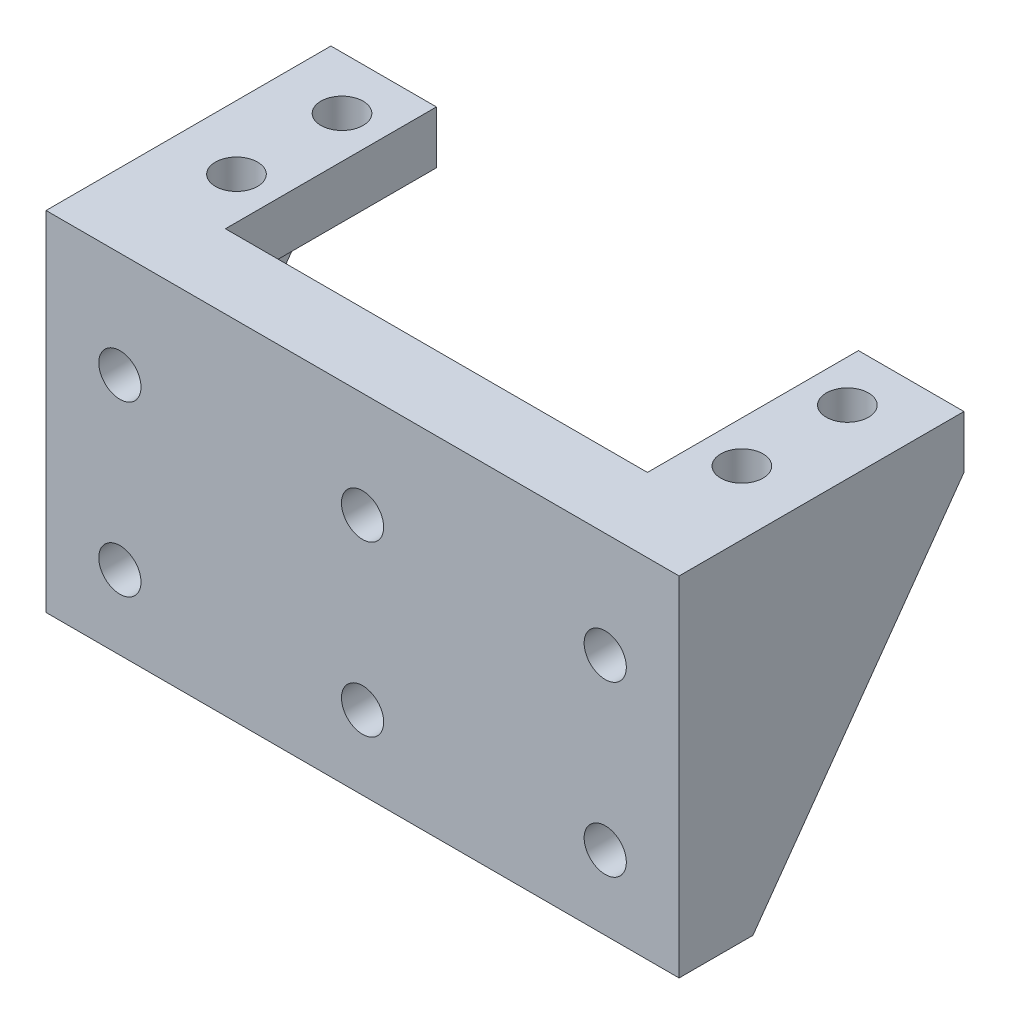
ISO-10303-21;
HEADER;
FILE_DESCRIPTION(('STEP AP214'),'2;1');
FILE_NAME('part.step','',(''),(''),'','','');
FILE_SCHEMA(('AUTOMOTIVE_DESIGN { 1 0 10303 214 1 1 1 1 }'));
ENDSEC;
DATA;
#1=APPLICATION_CONTEXT('core data for automotive mechanical design processes');
#2=APPLICATION_PROTOCOL_DEFINITION('international standard','automotive_design',2000,#1);
#3=PRODUCT_CONTEXT('',#1,'mechanical');
#4=PRODUCT('Part','Part','',(#3));
#5=PRODUCT_RELATED_PRODUCT_CATEGORY('part','',(#4));
#6=PRODUCT_DEFINITION_FORMATION('','',#4);
#7=PRODUCT_DEFINITION_CONTEXT('part definition',#1,'design');
#8=PRODUCT_DEFINITION('design','',#6,#7);
#9=PRODUCT_DEFINITION_SHAPE('','',#8);
#10=(LENGTH_UNIT() NAMED_UNIT(*) SI_UNIT(.MILLI.,.METRE.));
#11=(NAMED_UNIT(*) PLANE_ANGLE_UNIT() SI_UNIT($,.RADIAN.));
#12=(NAMED_UNIT(*) SI_UNIT($,.STERADIAN.) SOLID_ANGLE_UNIT());
#13=UNCERTAINTY_MEASURE_WITH_UNIT(LENGTH_MEASURE(1.E-05),#10,'distance_accuracy_value','');
#14=(GEOMETRIC_REPRESENTATION_CONTEXT(3) GLOBAL_UNCERTAINTY_ASSIGNED_CONTEXT((#13)) GLOBAL_UNIT_ASSIGNED_CONTEXT((#10,
#11,#12)) REPRESENTATION_CONTEXT('',''));
#15=CARTESIAN_POINT('',(0.,0.,0.));
#16=DIRECTION('',(0.,0.,1.));
#17=DIRECTION('',(1.,0.,0.));
#18=AXIS2_PLACEMENT_3D('',#15,#16,#17);
#19=CARTESIAN_POINT('',(43.,-5.00000000000001,7.00000000000001));
#20=DIRECTION('',(0.,0.,-1.));
#21=DIRECTION('',(-1.,0.,0.));
#22=AXIS2_PLACEMENT_3D('',#19,#20,#21);
#23=CYLINDRICAL_SURFACE('',#22,2.);
#24=CARTESIAN_POINT('',(43.,-5.00000000000001,7.00000000000001));
#25=DIRECTION('',(0.,0.,-1.));
#26=DIRECTION('',(-1.,0.,0.));
#27=AXIS2_PLACEMENT_3D('',#24,#25,#26);
#28=CIRCLE('',#27,2.);
#29=CARTESIAN_POINT('',(41.,-5.00000000000001,7.00000000000001));
#30=VERTEX_POINT('',#29);
#31=EDGE_CURVE('E132',#30,#30,#28,.T.);
#32=ORIENTED_EDGE('',*,*,#31,.F.);
#33=EDGE_LOOP('',(#32));
#34=FACE_BOUND('',#33,.T.);
#35=CARTESIAN_POINT('',(43.,-5.00000000000001,2.80000000000001));
#36=DIRECTION('',(0.,0.,-1.));
#37=DIRECTION('',(-1.,0.,0.));
#38=AXIS2_PLACEMENT_3D('',#35,#36,#37);
#39=CIRCLE('',#38,2.);
#40=CARTESIAN_POINT('',(41.,-5.00000000000001,2.8));
#41=VERTEX_POINT('',#40);
#42=EDGE_CURVE('E490',#41,#41,#39,.T.);
#43=ORIENTED_EDGE('',*,*,#42,.T.);
#44=EDGE_LOOP('',(#43));
#45=FACE_BOUND('',#44,.T.);
#46=ADVANCED_FACE('F35',(#34,#45),#23,.F.);
#47=CARTESIAN_POINT('',(20.,-5.,7.));
#48=DIRECTION('',(0.,0.,-1.));
#49=DIRECTION('',(-1.,0.,0.));
#50=AXIS2_PLACEMENT_3D('',#47,#48,#49);
#51=CYLINDRICAL_SURFACE('',#50,2.);
#52=CARTESIAN_POINT('',(20.,-5.,7.));
#53=DIRECTION('',(0.,0.,-1.));
#54=DIRECTION('',(-1.,0.,0.));
#55=AXIS2_PLACEMENT_3D('',#52,#53,#54);
#56=CIRCLE('',#55,2.);
#57=CARTESIAN_POINT('',(18.,-5.,7.));
#58=VERTEX_POINT('',#57);
#59=EDGE_CURVE('E258',#58,#58,#56,.T.);
#60=ORIENTED_EDGE('',*,*,#59,.F.);
#61=EDGE_LOOP('',(#60));
#62=FACE_BOUND('',#61,.T.);
#63=CARTESIAN_POINT('',(20.,-5.,2.8));
#64=DIRECTION('',(0.,0.,-1.));
#65=DIRECTION('',(-1.,0.,0.));
#66=AXIS2_PLACEMENT_3D('',#63,#64,#65);
#67=CIRCLE('',#66,2.);
#68=CARTESIAN_POINT('',(18.,-5.,2.8));
#69=VERTEX_POINT('',#68);
#70=EDGE_CURVE('E39',#69,#69,#67,.F.);
#71=ORIENTED_EDGE('',*,*,#70,.F.);
#72=EDGE_LOOP('',(#71));
#73=FACE_BOUND('',#72,.T.);
#74=ADVANCED_FACE('F336',(#62,#73),#51,.F.);
#75=CARTESIAN_POINT('',(20.,-21.,7.));
#76=DIRECTION('',(0.,0.,-1.));
#77=DIRECTION('',(-1.,0.,0.));
#78=AXIS2_PLACEMENT_3D('',#75,#76,#77);
#79=CYLINDRICAL_SURFACE('',#78,2.);
#80=CARTESIAN_POINT('',(20.,-21.,7.));
#81=DIRECTION('',(0.,0.,-1.));
#82=DIRECTION('',(-1.,0.,0.));
#83=AXIS2_PLACEMENT_3D('',#80,#81,#82);
#84=CIRCLE('',#83,2.);
#85=CARTESIAN_POINT('',(18.,-21.,7.));
#86=VERTEX_POINT('',#85);
#87=EDGE_CURVE('E262',#86,#86,#84,.T.);
#88=ORIENTED_EDGE('',*,*,#87,.F.);
#89=EDGE_LOOP('',(#88));
#90=FACE_BOUND('',#89,.T.);
#91=CARTESIAN_POINT('',(20.,-21.,2.8));
#92=DIRECTION('',(0.,0.,-1.));
#93=DIRECTION('',(-1.,0.,0.));
#94=AXIS2_PLACEMENT_3D('',#91,#92,#93);
#95=CIRCLE('',#94,2.);
#96=CARTESIAN_POINT('',(18.,-21.,2.8));
#97=VERTEX_POINT('',#96);
#98=EDGE_CURVE('E253',#97,#97,#95,.F.);
#99=ORIENTED_EDGE('',*,*,#98,.F.);
#100=EDGE_LOOP('',(#99));
#101=FACE_BOUND('',#100,.T.);
#102=ADVANCED_FACE('F343',(#90,#101),#79,.F.);
#103=CARTESIAN_POINT('',(43.,-21.,7.00000000000001));
#104=DIRECTION('',(0.,0.,-1.));
#105=DIRECTION('',(-1.,0.,0.));
#106=AXIS2_PLACEMENT_3D('',#103,#104,#105);
#107=CYLINDRICAL_SURFACE('',#106,2.);
#108=CARTESIAN_POINT('',(43.,-21.,7.00000000000001));
#109=DIRECTION('',(0.,0.,-1.));
#110=DIRECTION('',(-1.,0.,0.));
#111=AXIS2_PLACEMENT_3D('',#108,#109,#110);
#112=CIRCLE('',#111,2.);
#113=CARTESIAN_POINT('',(41.,-21.,7.00000000000001));
#114=VERTEX_POINT('',#113);
#115=EDGE_CURVE('E267',#114,#114,#112,.T.);
#116=ORIENTED_EDGE('',*,*,#115,.F.);
#117=EDGE_LOOP('',(#116));
#118=FACE_BOUND('',#117,.T.);
#119=CARTESIAN_POINT('',(43.,-21.,2.8));
#120=DIRECTION('',(0.,0.,-1.));
#121=DIRECTION('',(-1.,0.,0.));
#122=AXIS2_PLACEMENT_3D('',#119,#120,#121);
#123=CIRCLE('',#122,2.);
#124=CARTESIAN_POINT('',(41.,-21.,2.8));
#125=VERTEX_POINT('',#124);
#126=EDGE_CURVE('E250',#125,#125,#123,.F.);
#127=ORIENTED_EDGE('',*,*,#126,.F.);
#128=EDGE_LOOP('',(#127));
#129=FACE_BOUND('',#128,.T.);
#130=ADVANCED_FACE('F405',(#118,#129),#107,.F.);
#131=CARTESIAN_POINT('',(-3.00000000000001,-21.,7.));
#132=DIRECTION('',(0.,0.,-1.));
#133=DIRECTION('',(-1.,0.,0.));
#134=AXIS2_PLACEMENT_3D('',#131,#132,#133);
#135=CYLINDRICAL_SURFACE('',#134,2.);
#136=CARTESIAN_POINT('',(-3.00000000000001,-21.,7.));
#137=DIRECTION('',(0.,0.,-1.));
#138=DIRECTION('',(-1.,0.,0.));
#139=AXIS2_PLACEMENT_3D('',#136,#137,#138);
#140=CIRCLE('',#139,2.);
#141=CARTESIAN_POINT('',(-5.00000000000001,-21.,7.));
#142=VERTEX_POINT('',#141);
#143=EDGE_CURVE('E276',#142,#142,#140,.T.);
#144=ORIENTED_EDGE('',*,*,#143,.F.);
#145=EDGE_LOOP('',(#144));
#146=FACE_BOUND('',#145,.T.);
#147=CARTESIAN_POINT('',(-3.00000000000001,-21.,2.8));
#148=DIRECTION('',(0.,0.,-1.));
#149=DIRECTION('',(-1.,0.,0.));
#150=AXIS2_PLACEMENT_3D('',#147,#148,#149);
#151=CIRCLE('',#150,2.);
#152=CARTESIAN_POINT('',(-5.00000000000001,-21.,2.8));
#153=VERTEX_POINT('',#152);
#154=EDGE_CURVE('E247',#153,#153,#151,.F.);
#155=ORIENTED_EDGE('',*,*,#154,.F.);
#156=EDGE_LOOP('',(#155));
#157=FACE_BOUND('',#156,.T.);
#158=ADVANCED_FACE('F390',(#146,#157),#135,.F.);
#159=CARTESIAN_POINT('',(-3.00000000000001,-5.,7.));
#160=DIRECTION('',(0.,0.,-1.));
#161=DIRECTION('',(-1.,0.,0.));
#162=AXIS2_PLACEMENT_3D('',#159,#160,#161);
#163=CYLINDRICAL_SURFACE('',#162,2.);
#164=CARTESIAN_POINT('',(-3.00000000000001,-5.,7.));
#165=DIRECTION('',(0.,0.,-1.));
#166=DIRECTION('',(-1.,0.,0.));
#167=AXIS2_PLACEMENT_3D('',#164,#165,#166);
#168=CIRCLE('',#167,2.);
#169=CARTESIAN_POINT('',(-5.00000000000001,-5.,7.));
#170=VERTEX_POINT('',#169);
#171=EDGE_CURVE('E273',#170,#170,#168,.T.);
#172=ORIENTED_EDGE('',*,*,#171,.F.);
#173=EDGE_LOOP('',(#172));
#174=FACE_BOUND('',#173,.T.);
#175=CARTESIAN_POINT('',(-3.00000000000001,-5.,2.8));
#176=DIRECTION('',(0.,0.,-1.));
#177=DIRECTION('',(-1.,0.,0.));
#178=AXIS2_PLACEMENT_3D('',#175,#176,#177);
#179=CIRCLE('',#178,2.);
#180=CARTESIAN_POINT('',(-5.00000000000001,-5.,2.8));
#181=VERTEX_POINT('',#180);
#182=EDGE_CURVE('E474',#181,#181,#179,.T.);
#183=ORIENTED_EDGE('',*,*,#182,.T.);
#184=EDGE_LOOP('',(#183));
#185=FACE_BOUND('',#184,.T.);
#186=ADVANCED_FACE('F383',(#174,#185),#163,.F.);
#187=CARTESIAN_POINT('',(0.,0.,0.));
#188=DIRECTION('',(0.,1.,0.));
#189=DIRECTION('',(0.,0.,1.));
#190=AXIS2_PLACEMENT_3D('',#187,#188,#189);
#191=PLANE('',#190);
#192=CARTESIAN_POINT('',(43.95,0.,-15.));
#193=DIRECTION('',(0.,-1.,0.));
#194=DIRECTION('',(0.,0.,-1.));
#195=AXIS2_PLACEMENT_3D('',#192,#193,#194);
#196=CIRCLE('',#195,2.);
#197=CARTESIAN_POINT('',(43.95,0.,-17.));
#198=VERTEX_POINT('',#197);
#199=EDGE_CURVE('E179',#198,#198,#196,.T.);
#200=ORIENTED_EDGE('',*,*,#199,.F.);
#201=EDGE_LOOP('',(#200));
#202=FACE_BOUND('',#201,.T.);
#203=CARTESIAN_POINT('',(43.95,0.,-5.00000000000001));
#204=DIRECTION('',(0.,-1.,0.));
#205=DIRECTION('',(0.,0.,-1.));
#206=AXIS2_PLACEMENT_3D('',#203,#204,#205);
#207=CIRCLE('',#206,2.);
#208=CARTESIAN_POINT('',(43.95,0.,-7.00000000000001));
#209=VERTEX_POINT('',#208);
#210=EDGE_CURVE('E186',#209,#209,#207,.T.);
#211=ORIENTED_EDGE('',*,*,#210,.F.);
#212=EDGE_LOOP('',(#211));
#213=FACE_BOUND('',#212,.T.);
#214=DIRECTION('',(-1.,0.,0.));
#215=VECTOR('',#214,1.);
#216=CARTESIAN_POINT('',(76.8617393793236,0.,0.));
#217=LINE('',#216,#215);
#218=CARTESIAN_POINT('',(48.,0.,0.));
#219=VERTEX_POINT('',#218);
#220=CARTESIAN_POINT('',(40.,0.,0.));
#221=VERTEX_POINT('',#220);
#222=EDGE_CURVE('E170',#219,#221,#217,.T.);
#223=ORIENTED_EDGE('',*,*,#222,.T.);
#224=DIRECTION('',(0.,0.,-1.));
#225=VECTOR('',#224,1.);
#226=CARTESIAN_POINT('',(40.,0.,0.));
#227=LINE('',#226,#225);
#228=CARTESIAN_POINT('',(40.,0.,-20.));
#229=VERTEX_POINT('',#228);
#230=EDGE_CURVE('E237',#221,#229,#227,.T.);
#231=ORIENTED_EDGE('',*,*,#230,.T.);
#232=DIRECTION('',(1.,0.,0.));
#233=VECTOR('',#232,1.);
#234=CARTESIAN_POINT('',(0.,0.,-20.));
#235=LINE('',#234,#233);
#236=CARTESIAN_POINT('',(48.,0.,-20.));
#237=VERTEX_POINT('',#236);
#238=EDGE_CURVE('E234',#229,#237,#235,.T.);
#239=ORIENTED_EDGE('',*,*,#238,.T.);
#240=DIRECTION('',(0.,0.,1.));
#241=VECTOR('',#240,1.);
#242=CARTESIAN_POINT('',(48.,0.,0.));
#243=LINE('',#242,#241);
#244=EDGE_CURVE('E231',#237,#219,#243,.T.);
#245=ORIENTED_EDGE('',*,*,#244,.T.);
#246=EDGE_LOOP('',(#223,#231,#239,#245));
#247=FACE_BOUND('',#246,.T.);
#248=ADVANCED_FACE('F381',(#202,#213,#247),#191,.F.);
#249=CARTESIAN_POINT('',(-3.95,0.,-15.));
#250=DIRECTION('',(0.,-1.,0.));
#251=DIRECTION('',(0.,0.,-1.));
#252=AXIS2_PLACEMENT_3D('',#249,#250,#251);
#253=CIRCLE('',#252,2.);
#254=CARTESIAN_POINT('',(-3.95,0.,-17.));
#255=VERTEX_POINT('',#254);
#256=EDGE_CURVE('E174',#255,#255,#253,.T.);
#257=ORIENTED_EDGE('',*,*,#256,.F.);
#258=EDGE_LOOP('',(#257));
#259=FACE_BOUND('',#258,.T.);
#260=CARTESIAN_POINT('',(-3.95,0.,-5.00000000000001));
#261=DIRECTION('',(0.,-1.,0.));
#262=DIRECTION('',(0.,0.,-1.));
#263=AXIS2_PLACEMENT_3D('',#260,#261,#262);
#264=CIRCLE('',#263,2.);
#265=CARTESIAN_POINT('',(-3.95,0.,-7.00000000000001));
#266=VERTEX_POINT('',#265);
#267=EDGE_CURVE('E180',#266,#266,#264,.T.);
#268=ORIENTED_EDGE('',*,*,#267,.F.);
#269=EDGE_LOOP('',(#268));
#270=FACE_BOUND('',#269,.T.);
#271=DIRECTION('',(1.,0.,0.));
#272=VECTOR('',#271,1.);
#273=CARTESIAN_POINT('',(0.,0.,0.));
#274=LINE('',#273,#272);
#275=CARTESIAN_POINT('',(-8.,0.,0.));
#276=VERTEX_POINT('',#275);
#277=CARTESIAN_POINT('',(0.,0.,0.));
#278=VERTEX_POINT('',#277);
#279=EDGE_CURVE('E197',#276,#278,#274,.T.);
#280=ORIENTED_EDGE('',*,*,#279,.F.);
#281=DIRECTION('',(0.,0.,1.));
#282=VECTOR('',#281,1.);
#283=CARTESIAN_POINT('',(-8.,0.,0.));
#284=LINE('',#283,#282);
#285=CARTESIAN_POINT('',(-8.00000000000001,0.,-20.));
#286=VERTEX_POINT('',#285);
#287=EDGE_CURVE('E229',#286,#276,#284,.T.);
#288=ORIENTED_EDGE('',*,*,#287,.F.);
#289=DIRECTION('',(-1.,0.,0.));
#290=VECTOR('',#289,1.);
#291=CARTESIAN_POINT('',(0.,0.,-20.));
#292=LINE('',#291,#290);
#293=CARTESIAN_POINT('',(0.,0.,-20.));
#294=VERTEX_POINT('',#293);
#295=EDGE_CURVE('E140',#294,#286,#292,.T.);
#296=ORIENTED_EDGE('',*,*,#295,.F.);
#297=DIRECTION('',(0.,0.,1.));
#298=VECTOR('',#297,1.);
#299=CARTESIAN_POINT('',(0.,0.,0.));
#300=LINE('',#299,#298);
#301=EDGE_CURVE('E213',#294,#278,#300,.T.);
#302=ORIENTED_EDGE('',*,*,#301,.T.);
#303=EDGE_LOOP('',(#280,#288,#296,#302));
#304=FACE_BOUND('',#303,.T.);
#305=ADVANCED_FACE('F291',(#259,#270,#304),#191,.F.);
#306=CARTESIAN_POINT('',(0.,5.,-20.));
#307=DIRECTION('',(0.,0.,1.));
#308=DIRECTION('',(1.,0.,0.));
#309=AXIS2_PLACEMENT_3D('',#306,#307,#308);
#310=PLANE('',#309);
#311=ORIENTED_EDGE('',*,*,#295,.T.);
#312=DIRECTION('',(-1.,0.,0.));
#313=VECTOR('',#312,1.);
#314=CARTESIAN_POINT('',(50.,0.,-20.));
#315=LINE('',#314,#313);
#316=CARTESIAN_POINT('',(-10.,0.,-20.));
#317=VERTEX_POINT('',#316);
#318=EDGE_CURVE('E125',#286,#317,#315,.T.);
#319=ORIENTED_EDGE('',*,*,#318,.T.);
#320=DIRECTION('',(0.,-1.,0.));
#321=VECTOR('',#320,1.);
#322=CARTESIAN_POINT('',(-10.,5.,-20.));
#323=LINE('',#322,#321);
#324=CARTESIAN_POINT('',(-10.,5.,-20.));
#325=VERTEX_POINT('',#324);
#326=EDGE_CURVE('E138',#325,#317,#323,.T.);
#327=ORIENTED_EDGE('',*,*,#326,.F.);
#328=DIRECTION('',(-1.,0.,0.));
#329=VECTOR('',#328,1.);
#330=CARTESIAN_POINT('',(0.,5.,-20.));
#331=LINE('',#330,#329);
#332=CARTESIAN_POINT('',(0.,5.,-20.));
#333=VERTEX_POINT('',#332);
#334=EDGE_CURVE('E210',#333,#325,#331,.T.);
#335=ORIENTED_EDGE('',*,*,#334,.F.);
#336=DIRECTION('',(0.,-1.,0.));
#337=VECTOR('',#336,1.);
#338=CARTESIAN_POINT('',(0.,5.,-20.));
#339=LINE('',#338,#337);
#340=EDGE_CURVE('E227',#333,#294,#339,.T.);
#341=ORIENTED_EDGE('',*,*,#340,.T.);
#342=EDGE_LOOP('',(#311,#319,#327,#335,#341));
#343=FACE_BOUND('',#342,.T.);
#344=ADVANCED_FACE('F37',(#343),#310,.F.);
#345=CARTESIAN_POINT('',(0.,5.,7.));
#346=DIRECTION('',(0.,0.,-1.));
#347=DIRECTION('',(-1.,0.,0.));
#348=AXIS2_PLACEMENT_3D('',#345,#346,#347);
#349=PLANE('',#348);
#350=ORIENTED_EDGE('',*,*,#171,.T.);
#351=EDGE_LOOP('',(#350));
#352=FACE_BOUND('',#351,.T.);
#353=ORIENTED_EDGE('',*,*,#143,.T.);
#354=EDGE_LOOP('',(#353));
#355=FACE_BOUND('',#354,.T.);
#356=ORIENTED_EDGE('',*,*,#115,.T.);
#357=EDGE_LOOP('',(#356));
#358=FACE_BOUND('',#357,.T.);
#359=ORIENTED_EDGE('',*,*,#87,.T.);
#360=EDGE_LOOP('',(#359));
#361=FACE_BOUND('',#360,.T.);
#362=ORIENTED_EDGE('',*,*,#59,.T.);
#363=EDGE_LOOP('',(#362));
#364=FACE_BOUND('',#363,.T.);
#365=ORIENTED_EDGE('',*,*,#31,.T.);
#366=EDGE_LOOP('',(#365));
#367=FACE_BOUND('',#366,.T.);
#368=DIRECTION('',(-1.,0.,0.));
#369=VECTOR('',#368,1.);
#370=CARTESIAN_POINT('',(0.,-28.,7.));
#371=LINE('',#370,#369);
#372=CARTESIAN_POINT('',(50.,-28.,7.));
#373=VERTEX_POINT('',#372);
#374=CARTESIAN_POINT('',(-10.,-28.,7.));
#375=VERTEX_POINT('',#374);
#376=EDGE_CURVE('E203',#373,#375,#371,.T.);
#377=ORIENTED_EDGE('',*,*,#376,.F.);
#378=DIRECTION('',(0.,-1.,0.));
#379=VECTOR('',#378,1.);
#380=CARTESIAN_POINT('',(50.,-28.,7.));
#381=LINE('',#380,#379);
#382=CARTESIAN_POINT('',(50.,5.,7.));
#383=VERTEX_POINT('',#382);
#384=EDGE_CURVE('E159',#383,#373,#381,.T.);
#385=ORIENTED_EDGE('',*,*,#384,.F.);
#386=DIRECTION('',(1.,0.,0.));
#387=VECTOR('',#386,1.);
#388=CARTESIAN_POINT('',(0.,5.,7.));
#389=LINE('',#388,#387);
#390=CARTESIAN_POINT('',(-10.,5.,7.));
#391=VERTEX_POINT('',#390);
#392=EDGE_CURVE('E212',#391,#383,#389,.T.);
#393=ORIENTED_EDGE('',*,*,#392,.F.);
#394=DIRECTION('',(0.,1.,0.));
#395=VECTOR('',#394,1.);
#396=CARTESIAN_POINT('',(-10.,5.,7.));
#397=LINE('',#396,#395);
#398=EDGE_CURVE('E151',#375,#391,#397,.T.);
#399=ORIENTED_EDGE('',*,*,#398,.F.);
#400=EDGE_LOOP('',(#377,#385,#393,#399));
#401=FACE_BOUND('',#400,.T.);
#402=ADVANCED_FACE('F302',(#352,#355,#358,#361,#364,#367,#401),#349,.F.);
#403=CARTESIAN_POINT('',(0.,5.,-20.));
#404=DIRECTION('',(0.,0.,-1.));
#405=DIRECTION('',(-1.,0.,0.));
#406=AXIS2_PLACEMENT_3D('',#403,#404,#405);
#407=PLANE('',#406);
#408=CARTESIAN_POINT('',(50.,0.,-20.));
#409=VERTEX_POINT('',#408);
#410=EDGE_CURVE('E52',#409,#237,#315,.T.);
#411=ORIENTED_EDGE('',*,*,#410,.T.);
#412=ORIENTED_EDGE('',*,*,#238,.F.);
#413=DIRECTION('',(0.,-1.,0.));
#414=VECTOR('',#413,1.);
#415=CARTESIAN_POINT('',(40.,5.,-20.));
#416=LINE('',#415,#414);
#417=CARTESIAN_POINT('',(40.,5.,-20.));
#418=VERTEX_POINT('',#417);
#419=EDGE_CURVE('E11',#418,#229,#416,.T.);
#420=ORIENTED_EDGE('',*,*,#419,.F.);
#421=DIRECTION('',(1.,0.,0.));
#422=VECTOR('',#421,1.);
#423=CARTESIAN_POINT('',(0.,5.,-20.));
#424=LINE('',#423,#422);
#425=CARTESIAN_POINT('',(50.,5.,-20.));
#426=VERTEX_POINT('',#425);
#427=EDGE_CURVE('E215',#418,#426,#424,.T.);
#428=ORIENTED_EDGE('',*,*,#427,.T.);
#429=DIRECTION('',(0.,1.,0.));
#430=VECTOR('',#429,1.);
#431=CARTESIAN_POINT('',(50.,-28.,-20.));
#432=LINE('',#431,#430);
#433=EDGE_CURVE('E165',#409,#426,#432,.T.);
#434=ORIENTED_EDGE('',*,*,#433,.F.);
#435=EDGE_LOOP('',(#411,#412,#420,#428,#434));
#436=FACE_BOUND('',#435,.T.);
#437=ADVANCED_FACE('F313',(#436),#407,.T.);
#438=CARTESIAN_POINT('',(40.,5.,0.));
#439=DIRECTION('',(-1.,0.,0.));
#440=DIRECTION('',(0.,0.,1.));
#441=AXIS2_PLACEMENT_3D('',#438,#439,#440);
#442=PLANE('',#441);
#443=ORIENTED_EDGE('',*,*,#230,.F.);
#444=DIRECTION('',(0.,-1.,0.));
#445=VECTOR('',#444,1.);
#446=CARTESIAN_POINT('',(40.,5.,0.));
#447=LINE('',#446,#445);
#448=CARTESIAN_POINT('',(40.,5.,0.));
#449=VERTEX_POINT('',#448);
#450=EDGE_CURVE('E44',#449,#221,#447,.T.);
#451=ORIENTED_EDGE('',*,*,#450,.F.);
#452=DIRECTION('',(0.,0.,-1.));
#453=VECTOR('',#452,1.);
#454=CARTESIAN_POINT('',(40.,5.,0.));
#455=LINE('',#454,#453);
#456=EDGE_CURVE('E218',#449,#418,#455,.T.);
#457=ORIENTED_EDGE('',*,*,#456,.T.);
#458=ORIENTED_EDGE('',*,*,#419,.T.);
#459=EDGE_LOOP('',(#443,#451,#457,#458));
#460=FACE_BOUND('',#459,.T.);
#461=ADVANCED_FACE('F319',(#460),#442,.T.);
#462=CARTESIAN_POINT('',(0.,5.,0.));
#463=DIRECTION('',(0.,0.,-1.));
#464=DIRECTION('',(-1.,0.,0.));
#465=AXIS2_PLACEMENT_3D('',#462,#463,#464);
#466=PLANE('',#465);
#467=CARTESIAN_POINT('',(20.,-21.,0.));
#468=DIRECTION('',(0.,0.,-1.));
#469=DIRECTION('',(-1.,0.,0.));
#470=AXIS2_PLACEMENT_3D('',#467,#468,#469);
#471=CIRCLE('',#470,4.);
#472=CARTESIAN_POINT('',(16.,-21.,0.));
#473=VERTEX_POINT('',#472);
#474=EDGE_CURVE('E495',#473,#473,#471,.T.);
#475=ORIENTED_EDGE('',*,*,#474,.F.);
#476=EDGE_LOOP('',(#475));
#477=FACE_BOUND('',#476,.T.);
#478=CARTESIAN_POINT('',(43.,-21.,0.));
#479=DIRECTION('',(0.,0.,-1.));
#480=DIRECTION('',(-1.,0.,0.));
#481=AXIS2_PLACEMENT_3D('',#478,#479,#480);
#482=CIRCLE('',#481,4.);
#483=CARTESIAN_POINT('',(39.,-21.,0.));
#484=VERTEX_POINT('',#483);
#485=EDGE_CURVE('E502',#484,#484,#482,.T.);
#486=ORIENTED_EDGE('',*,*,#485,.F.);
#487=EDGE_LOOP('',(#486));
#488=FACE_BOUND('',#487,.T.);
#489=CARTESIAN_POINT('',(-3.00000000000001,-21.,0.));
#490=DIRECTION('',(0.,0.,-1.));
#491=DIRECTION('',(-1.,0.,0.));
#492=AXIS2_PLACEMENT_3D('',#489,#490,#491);
#493=CIRCLE('',#492,4.);
#494=CARTESIAN_POINT('',(-7.00000000000001,-21.,0.));
#495=VERTEX_POINT('',#494);
#496=EDGE_CURVE('E483',#495,#495,#493,.T.);
#497=ORIENTED_EDGE('',*,*,#496,.F.);
#498=EDGE_LOOP('',(#497));
#499=FACE_BOUND('',#498,.T.);
#500=CARTESIAN_POINT('',(43.,-5.00000000000001,0.));
#501=DIRECTION('',(0.,0.,-1.));
#502=DIRECTION('',(-1.,0.,0.));
#503=AXIS2_PLACEMENT_3D('',#500,#501,#502);
#504=CIRCLE('',#503,4.);
#505=CARTESIAN_POINT('',(39.,-5.00000000000001,0.));
#506=VERTEX_POINT('',#505);
#507=EDGE_CURVE('E480',#506,#506,#504,.T.);
#508=ORIENTED_EDGE('',*,*,#507,.F.);
#509=EDGE_LOOP('',(#508));
#510=FACE_BOUND('',#509,.T.);
#511=CARTESIAN_POINT('',(20.,-5.,0.));
#512=DIRECTION('',(0.,0.,-1.));
#513=DIRECTION('',(-1.,0.,0.));
#514=AXIS2_PLACEMENT_3D('',#511,#512,#513);
#515=CIRCLE('',#514,4.);
#516=CARTESIAN_POINT('',(16.,-5.,0.));
#517=VERTEX_POINT('',#516);
#518=EDGE_CURVE('E506',#517,#517,#515,.T.);
#519=ORIENTED_EDGE('',*,*,#518,.F.);
#520=EDGE_LOOP('',(#519));
#521=FACE_BOUND('',#520,.T.);
#522=CARTESIAN_POINT('',(-3.00000000000001,-5.,0.));
#523=DIRECTION('',(0.,0.,-1.));
#524=DIRECTION('',(-1.,0.,0.));
#525=AXIS2_PLACEMENT_3D('',#522,#523,#524);
#526=CIRCLE('',#525,4.);
#527=CARTESIAN_POINT('',(-7.00000000000001,-5.,0.));
#528=VERTEX_POINT('',#527);
#529=EDGE_CURVE('E271',#528,#528,#526,.T.);
#530=ORIENTED_EDGE('',*,*,#529,.F.);
#531=EDGE_LOOP('',(#530));
#532=FACE_BOUND('',#531,.T.);
#533=ORIENTED_EDGE('',*,*,#450,.T.);
#534=ORIENTED_EDGE('',*,*,#222,.F.);
#535=DIRECTION('',(0.,1.,0.));
#536=VECTOR('',#535,1.);
#537=CARTESIAN_POINT('',(48.,-28.,0.));
#538=LINE('',#537,#536);
#539=CARTESIAN_POINT('',(48.,-28.,0.));
#540=VERTEX_POINT('',#539);
#541=EDGE_CURVE('E171',#540,#219,#538,.T.);
#542=ORIENTED_EDGE('',*,*,#541,.F.);
#543=DIRECTION('',(1.,0.,0.));
#544=VECTOR('',#543,1.);
#545=CARTESIAN_POINT('',(0.,-28.,0.));
#546=LINE('',#545,#544);
#547=CARTESIAN_POINT('',(-8.00000000000001,-28.,0.));
#548=VERTEX_POINT('',#547);
#549=EDGE_CURVE('E200',#548,#540,#546,.T.);
#550=ORIENTED_EDGE('',*,*,#549,.F.);
#551=DIRECTION('',(0.,1.,0.));
#552=VECTOR('',#551,1.);
#553=CARTESIAN_POINT('',(-8.,-28.,0.));
#554=LINE('',#553,#552);
#555=EDGE_CURVE('E205',#548,#276,#554,.T.);
#556=ORIENTED_EDGE('',*,*,#555,.T.);
#557=ORIENTED_EDGE('',*,*,#279,.T.);
#558=DIRECTION('',(0.,-1.,0.));
#559=VECTOR('',#558,1.);
#560=CARTESIAN_POINT('',(0.,5.,0.));
#561=LINE('',#560,#559);
#562=CARTESIAN_POINT('',(0.,5.,0.));
#563=VERTEX_POINT('',#562);
#564=EDGE_CURVE('E243',#563,#278,#561,.T.);
#565=ORIENTED_EDGE('',*,*,#564,.F.);
#566=DIRECTION('',(1.,0.,0.));
#567=VECTOR('',#566,1.);
#568=CARTESIAN_POINT('',(0.,5.,0.));
#569=LINE('',#568,#567);
#570=EDGE_CURVE('E221',#563,#449,#569,.T.);
#571=ORIENTED_EDGE('',*,*,#570,.T.);
#572=EDGE_LOOP('',(#533,#534,#542,#550,#556,#557,#565,#571));
#573=FACE_BOUND('',#572,.T.);
#574=ADVANCED_FACE('F294',(#477,#488,#499,#510,#521,#532,#573),#466,.T.);
#575=CARTESIAN_POINT('',(0.,5.,0.));
#576=DIRECTION('',(1.,0.,0.));
#577=DIRECTION('',(0.,0.,-1.));
#578=AXIS2_PLACEMENT_3D('',#575,#576,#577);
#579=PLANE('',#578);
#580=ORIENTED_EDGE('',*,*,#301,.F.);
#581=ORIENTED_EDGE('',*,*,#340,.F.);
#582=DIRECTION('',(0.,0.,1.));
#583=VECTOR('',#582,1.);
#584=CARTESIAN_POINT('',(0.,5.,0.));
#585=LINE('',#584,#583);
#586=EDGE_CURVE('E224',#333,#563,#585,.T.);
#587=ORIENTED_EDGE('',*,*,#586,.T.);
#588=ORIENTED_EDGE('',*,*,#564,.T.);
#589=EDGE_LOOP('',(#580,#581,#587,#588));
#590=FACE_BOUND('',#589,.T.);
#591=ADVANCED_FACE('F322',(#590),#579,.T.);
#592=CARTESIAN_POINT('',(0.,5.,0.));
#593=DIRECTION('',(0.,1.,0.));
#594=DIRECTION('',(0.,0.,1.));
#595=AXIS2_PLACEMENT_3D('',#592,#593,#594);
#596=PLANE('',#595);
#597=ORIENTED_EDGE('',*,*,#392,.T.);
#598=DIRECTION('',(0.,0.,1.));
#599=VECTOR('',#598,1.);
#600=CARTESIAN_POINT('',(50.,5.,7.));
#601=LINE('',#600,#599);
#602=EDGE_CURVE('E167',#426,#383,#601,.T.);
#603=ORIENTED_EDGE('',*,*,#602,.F.);
#604=ORIENTED_EDGE('',*,*,#427,.F.);
#605=ORIENTED_EDGE('',*,*,#456,.F.);
#606=ORIENTED_EDGE('',*,*,#570,.F.);
#607=ORIENTED_EDGE('',*,*,#586,.F.);
#608=ORIENTED_EDGE('',*,*,#334,.T.);
#609=DIRECTION('',(0.,0.,-1.));
#610=VECTOR('',#609,1.);
#611=CARTESIAN_POINT('',(-10.,5.,-20.));
#612=LINE('',#611,#610);
#613=EDGE_CURVE('E147',#391,#325,#612,.T.);
#614=ORIENTED_EDGE('',*,*,#613,.F.);
#615=EDGE_LOOP('',(#597,#603,#604,#605,#606,#607,#608,#614));
#616=FACE_BOUND('',#615,.T.);
#617=CARTESIAN_POINT('',(-3.95,5.,-15.));
#618=DIRECTION('',(0.,-1.,0.));
#619=DIRECTION('',(0.,0.,-1.));
#620=AXIS2_PLACEMENT_3D('',#617,#618,#619);
#621=CIRCLE('',#620,2.);
#622=CARTESIAN_POINT('',(-3.95,5.,-17.));
#623=VERTEX_POINT('',#622);
#624=EDGE_CURVE('E189',#623,#623,#621,.T.);
#625=ORIENTED_EDGE('',*,*,#624,.T.);
#626=EDGE_LOOP('',(#625));
#627=FACE_BOUND('',#626,.T.);
#628=CARTESIAN_POINT('',(43.95,5.,-5.00000000000001));
#629=DIRECTION('',(0.,-1.,0.));
#630=DIRECTION('',(0.,0.,-1.));
#631=AXIS2_PLACEMENT_3D('',#628,#629,#630);
#632=CIRCLE('',#631,2.);
#633=CARTESIAN_POINT('',(43.95,5.,-7.00000000000001));
#634=VERTEX_POINT('',#633);
#635=EDGE_CURVE('E183',#634,#634,#632,.T.);
#636=ORIENTED_EDGE('',*,*,#635,.T.);
#637=EDGE_LOOP('',(#636));
#638=FACE_BOUND('',#637,.T.);
#639=CARTESIAN_POINT('',(-3.95,5.,-5.00000000000001));
#640=DIRECTION('',(0.,-1.,0.));
#641=DIRECTION('',(0.,0.,-1.));
#642=AXIS2_PLACEMENT_3D('',#639,#640,#641);
#643=CIRCLE('',#642,2.);
#644=CARTESIAN_POINT('',(-3.95,5.,-7.00000000000001));
#645=VERTEX_POINT('',#644);
#646=EDGE_CURVE('E176',#645,#645,#643,.T.);
#647=ORIENTED_EDGE('',*,*,#646,.T.);
#648=EDGE_LOOP('',(#647));
#649=FACE_BOUND('',#648,.T.);
#650=CARTESIAN_POINT('',(43.95,5.,-15.));
#651=DIRECTION('',(0.,-1.,0.));
#652=DIRECTION('',(0.,0.,-1.));
#653=AXIS2_PLACEMENT_3D('',#650,#651,#652);
#654=CIRCLE('',#653,2.);
#655=CARTESIAN_POINT('',(43.95,5.,-17.));
#656=VERTEX_POINT('',#655);
#657=EDGE_CURVE('E194',#656,#656,#654,.T.);
#658=ORIENTED_EDGE('',*,*,#657,.T.);
#659=EDGE_LOOP('',(#658));
#660=FACE_BOUND('',#659,.T.);
#661=ADVANCED_FACE('F306',(#616,#627,#638,#649,#660),#596,.T.);
#662=CARTESIAN_POINT('',(0.,-28.,0.));
#663=DIRECTION('',(0.,-1.,0.));
#664=DIRECTION('',(0.,0.,-1.));
#665=AXIS2_PLACEMENT_3D('',#662,#663,#664);
#666=PLANE('',#665);
#667=ORIENTED_EDGE('',*,*,#376,.T.);
#668=DIRECTION('',(0.,0.,1.));
#669=VECTOR('',#668,1.);
#670=CARTESIAN_POINT('',(-10.,-28.,-20.));
#671=LINE('',#670,#669);
#672=CARTESIAN_POINT('',(-10.,-28.,0.));
#673=VERTEX_POINT('',#672);
#674=EDGE_CURVE('E148',#673,#375,#671,.T.);
#675=ORIENTED_EDGE('',*,*,#674,.F.);
#676=DIRECTION('',(-1.,0.,0.));
#677=VECTOR('',#676,1.);
#678=CARTESIAN_POINT('',(50.,-28.,0.));
#679=LINE('',#678,#677);
#680=EDGE_CURVE('E60',#548,#673,#679,.T.);
#681=ORIENTED_EDGE('',*,*,#680,.F.);
#682=ORIENTED_EDGE('',*,*,#549,.T.);
#683=CARTESIAN_POINT('',(50.,-28.,0.));
#684=VERTEX_POINT('',#683);
#685=EDGE_CURVE('E141',#684,#540,#679,.T.);
#686=ORIENTED_EDGE('',*,*,#685,.F.);
#687=DIRECTION('',(0.,0.,-1.));
#688=VECTOR('',#687,1.);
#689=CARTESIAN_POINT('',(50.,-28.,7.));
#690=LINE('',#689,#688);
#691=EDGE_CURVE('E162',#373,#684,#690,.T.);
#692=ORIENTED_EDGE('',*,*,#691,.F.);
#693=EDGE_LOOP('',(#667,#675,#681,#682,#686,#692));
#694=FACE_BOUND('',#693,.T.);
#695=ADVANCED_FACE('F298',(#694),#666,.T.);
#696=CARTESIAN_POINT('',(43.95,5.,-15.));
#697=DIRECTION('',(0.,-1.,0.));
#698=DIRECTION('',(0.,0.,-1.));
#699=AXIS2_PLACEMENT_3D('',#696,#697,#698);
#700=CYLINDRICAL_SURFACE('',#699,2.);
#701=ORIENTED_EDGE('',*,*,#657,.F.);
#702=EDGE_LOOP('',(#701));
#703=FACE_BOUND('',#702,.T.);
#704=ORIENTED_EDGE('',*,*,#199,.T.);
#705=EDGE_LOOP('',(#704));
#706=FACE_BOUND('',#705,.T.);
#707=ADVANCED_FACE('F372',(#703,#706),#700,.F.);
#708=CARTESIAN_POINT('',(43.95,5.,-5.00000000000001));
#709=DIRECTION('',(0.,-1.,0.));
#710=DIRECTION('',(0.,0.,-1.));
#711=AXIS2_PLACEMENT_3D('',#708,#709,#710);
#712=CYLINDRICAL_SURFACE('',#711,2.);
#713=ORIENTED_EDGE('',*,*,#635,.F.);
#714=EDGE_LOOP('',(#713));
#715=FACE_BOUND('',#714,.T.);
#716=ORIENTED_EDGE('',*,*,#210,.T.);
#717=EDGE_LOOP('',(#716));
#718=FACE_BOUND('',#717,.T.);
#719=ADVANCED_FACE('F368',(#715,#718),#712,.F.);
#720=CARTESIAN_POINT('',(-3.95,5.,-5.00000000000001));
#721=DIRECTION('',(0.,-1.,0.));
#722=DIRECTION('',(0.,0.,-1.));
#723=AXIS2_PLACEMENT_3D('',#720,#721,#722);
#724=CYLINDRICAL_SURFACE('',#723,2.);
#725=ORIENTED_EDGE('',*,*,#646,.F.);
#726=EDGE_LOOP('',(#725));
#727=FACE_BOUND('',#726,.T.);
#728=ORIENTED_EDGE('',*,*,#267,.T.);
#729=EDGE_LOOP('',(#728));
#730=FACE_BOUND('',#729,.T.);
#731=ADVANCED_FACE('F365',(#727,#730),#724,.F.);
#732=CARTESIAN_POINT('',(-3.95,5.,-15.));
#733=DIRECTION('',(0.,-1.,0.));
#734=DIRECTION('',(0.,0.,-1.));
#735=AXIS2_PLACEMENT_3D('',#732,#733,#734);
#736=CYLINDRICAL_SURFACE('',#735,2.);
#737=ORIENTED_EDGE('',*,*,#624,.F.);
#738=EDGE_LOOP('',(#737));
#739=FACE_BOUND('',#738,.T.);
#740=ORIENTED_EDGE('',*,*,#256,.T.);
#741=EDGE_LOOP('',(#740));
#742=FACE_BOUND('',#741,.T.);
#743=ADVANCED_FACE('F363',(#739,#742),#736,.F.);
#744=CARTESIAN_POINT('',(48.,0.,0.));
#745=DIRECTION('',(-1.,0.,0.));
#746=DIRECTION('',(0.,0.,1.));
#747=AXIS2_PLACEMENT_3D('',#744,#745,#746);
#748=PLANE('',#747);
#749=DIRECTION('',(0.,0.813733471206735,-0.581238193719096));
#750=VECTOR('',#749,1.);
#751=CARTESIAN_POINT('',(48.,-9.45945945945946,-13.2432432432432));
#752=LINE('',#751,#750);
#753=EDGE_CURVE('E149',#540,#237,#752,.T.);
#754=ORIENTED_EDGE('',*,*,#753,.F.);
#755=ORIENTED_EDGE('',*,*,#541,.T.);
#756=ORIENTED_EDGE('',*,*,#244,.F.);
#757=EDGE_LOOP('',(#754,#755,#756));
#758=FACE_BOUND('',#757,.T.);
#759=ADVANCED_FACE('F360',(#758),#748,.T.);
#760=CARTESIAN_POINT('',(50.,0.,0.));
#761=DIRECTION('',(-1.,0.,0.));
#762=DIRECTION('',(0.,0.,1.));
#763=AXIS2_PLACEMENT_3D('',#760,#761,#762);
#764=PLANE('',#763);
#765=ORIENTED_EDGE('',*,*,#691,.T.);
#766=DIRECTION('',(0.,0.813733471206735,-0.581238193719096));
#767=VECTOR('',#766,1.);
#768=CARTESIAN_POINT('',(50.,0.,-20.));
#769=LINE('',#768,#767);
#770=EDGE_CURVE('E131',#684,#409,#769,.T.);
#771=ORIENTED_EDGE('',*,*,#770,.T.);
#772=ORIENTED_EDGE('',*,*,#433,.T.);
#773=ORIENTED_EDGE('',*,*,#602,.T.);
#774=ORIENTED_EDGE('',*,*,#384,.T.);
#775=EDGE_LOOP('',(#765,#771,#772,#773,#774));
#776=FACE_BOUND('',#775,.T.);
#777=ADVANCED_FACE('F310',(#776),#764,.F.);
#778=CARTESIAN_POINT('',(-8.,0.,0.));
#779=DIRECTION('',(-1.,0.,0.));
#780=DIRECTION('',(0.,0.,1.));
#781=AXIS2_PLACEMENT_3D('',#778,#779,#780);
#782=PLANE('',#781);
#783=ORIENTED_EDGE('',*,*,#555,.F.);
#784=DIRECTION('',(0.,0.813733471206735,-0.581238193719096));
#785=VECTOR('',#784,1.);
#786=CARTESIAN_POINT('',(-8.00000000000001,-9.45945945945946,-13.2432432432432));
#787=LINE('',#786,#785);
#788=EDGE_CURVE('E153',#548,#286,#787,.T.);
#789=ORIENTED_EDGE('',*,*,#788,.T.);
#790=ORIENTED_EDGE('',*,*,#287,.T.);
#791=EDGE_LOOP('',(#783,#789,#790));
#792=FACE_BOUND('',#791,.T.);
#793=ADVANCED_FACE('F287',(#792),#782,.F.);
#794=CARTESIAN_POINT('',(-10.,0.,0.));
#795=DIRECTION('',(-1.,0.,0.));
#796=DIRECTION('',(0.,0.,1.));
#797=AXIS2_PLACEMENT_3D('',#794,#795,#796);
#798=PLANE('',#797);
#799=DIRECTION('',(0.,0.813733471206735,-0.581238193719096));
#800=VECTOR('',#799,1.);
#801=CARTESIAN_POINT('',(-10.,0.,-20.));
#802=LINE('',#801,#800);
#803=EDGE_CURVE('E122',#673,#317,#802,.T.);
#804=ORIENTED_EDGE('',*,*,#803,.F.);
#805=ORIENTED_EDGE('',*,*,#674,.T.);
#806=ORIENTED_EDGE('',*,*,#398,.T.);
#807=ORIENTED_EDGE('',*,*,#613,.T.);
#808=ORIENTED_EDGE('',*,*,#326,.T.);
#809=EDGE_LOOP('',(#804,#805,#806,#807,#808));
#810=FACE_BOUND('',#809,.T.);
#811=ADVANCED_FACE('F144',(#810),#798,.T.);
#812=CARTESIAN_POINT('',(50.,0.,-20.));
#813=DIRECTION('',(0.,0.581238193719096,0.813733471206735));
#814=DIRECTION('',(0.,-0.813733471206735,0.581238193719096));
#815=AXIS2_PLACEMENT_3D('',#812,#813,#814);
#816=PLANE('',#815);
#817=ORIENTED_EDGE('',*,*,#680,.T.);
#818=ORIENTED_EDGE('',*,*,#803,.T.);
#819=ORIENTED_EDGE('',*,*,#318,.F.);
#820=ORIENTED_EDGE('',*,*,#788,.F.);
#821=EDGE_LOOP('',(#817,#818,#819,#820));
#822=FACE_BOUND('',#821,.T.);
#823=ADVANCED_FACE('F124',(#822),#816,.F.);
#824=ORIENTED_EDGE('',*,*,#753,.T.);
#825=ORIENTED_EDGE('',*,*,#410,.F.);
#826=ORIENTED_EDGE('',*,*,#770,.F.);
#827=ORIENTED_EDGE('',*,*,#685,.T.);
#828=EDGE_LOOP('',(#824,#825,#826,#827));
#829=FACE_BOUND('',#828,.T.);
#830=ADVANCED_FACE('F351',(#829),#816,.F.);
#831=CARTESIAN_POINT('',(-3.00000000000001,-5.,2.8));
#832=DIRECTION('',(0.,0.,-1.));
#833=DIRECTION('',(-1.,0.,0.));
#834=AXIS2_PLACEMENT_3D('',#831,#832,#833);
#835=CYLINDRICAL_SURFACE('',#834,4.);
#836=CARTESIAN_POINT('',(-3.00000000000001,-5.,2.8));
#837=DIRECTION('',(0.,0.,-1.));
#838=DIRECTION('',(-1.,0.,0.));
#839=AXIS2_PLACEMENT_3D('',#836,#837,#838);
#840=CIRCLE('',#839,4.);
#841=CARTESIAN_POINT('',(-7.00000000000001,-5.,2.8));
#842=VERTEX_POINT('',#841);
#843=EDGE_CURVE('E251',#842,#842,#840,.T.);
#844=ORIENTED_EDGE('',*,*,#843,.F.);
#845=EDGE_LOOP('',(#844));
#846=FACE_BOUND('',#845,.T.);
#847=ORIENTED_EDGE('',*,*,#529,.T.);
#848=EDGE_LOOP('',(#847));
#849=FACE_BOUND('',#848,.T.);
#850=ADVANCED_FACE('F353',(#846,#849),#835,.F.);
#851=CARTESIAN_POINT('',(-3.00000000000001,-5.,2.8));
#852=DIRECTION('',(0.,0.,-1.));
#853=DIRECTION('',(-1.,0.,0.));
#854=AXIS2_PLACEMENT_3D('',#851,#852,#853);
#855=PLANE('',#854);
#856=ORIENTED_EDGE('',*,*,#182,.F.);
#857=EDGE_LOOP('',(#856));
#858=FACE_BOUND('',#857,.T.);
#859=ORIENTED_EDGE('',*,*,#843,.T.);
#860=EDGE_LOOP('',(#859));
#861=FACE_BOUND('',#860,.T.);
#862=ADVANCED_FACE('F459',(#858,#861),#855,.T.);
#863=CARTESIAN_POINT('',(-3.00000000000001,-21.,2.8));
#864=DIRECTION('',(0.,0.,-1.));
#865=DIRECTION('',(-1.,0.,0.));
#866=AXIS2_PLACEMENT_3D('',#863,#864,#865);
#867=PLANE('',#866);
#868=CARTESIAN_POINT('',(-3.00000000000001,-21.,2.8));
#869=DIRECTION('',(0.,0.,-1.));
#870=DIRECTION('',(-1.,0.,0.));
#871=AXIS2_PLACEMENT_3D('',#868,#869,#870);
#872=CIRCLE('',#871,4.);
#873=CARTESIAN_POINT('',(-7.00000000000001,-21.,2.8));
#874=VERTEX_POINT('',#873);
#875=EDGE_CURVE('E486',#874,#874,#872,.T.);
#876=ORIENTED_EDGE('',*,*,#875,.T.);
#877=EDGE_LOOP('',(#876));
#878=FACE_BOUND('',#877,.T.);
#879=ORIENTED_EDGE('',*,*,#154,.T.);
#880=EDGE_LOOP('',(#879));
#881=FACE_BOUND('',#880,.T.);
#882=ADVANCED_FACE('F434',(#878,#881),#867,.T.);
#883=CARTESIAN_POINT('',(-3.00000000000001,-21.,2.8));
#884=DIRECTION('',(0.,0.,-1.));
#885=DIRECTION('',(-1.,0.,0.));
#886=AXIS2_PLACEMENT_3D('',#883,#884,#885);
#887=CYLINDRICAL_SURFACE('',#886,4.);
#888=ORIENTED_EDGE('',*,*,#875,.F.);
#889=EDGE_LOOP('',(#888));
#890=FACE_BOUND('',#889,.T.);
#891=ORIENTED_EDGE('',*,*,#496,.T.);
#892=EDGE_LOOP('',(#891));
#893=FACE_BOUND('',#892,.T.);
#894=ADVANCED_FACE('F424',(#890,#893),#887,.F.);
#895=CARTESIAN_POINT('',(43.,-21.,2.80000000000001));
#896=DIRECTION('',(0.,0.,-1.));
#897=DIRECTION('',(-1.,0.,0.));
#898=AXIS2_PLACEMENT_3D('',#895,#896,#897);
#899=PLANE('',#898);
#900=CARTESIAN_POINT('',(43.,-21.,2.80000000000001));
#901=DIRECTION('',(0.,0.,-1.));
#902=DIRECTION('',(-1.,0.,0.));
#903=AXIS2_PLACEMENT_3D('',#900,#901,#902);
#904=CIRCLE('',#903,4.);
#905=CARTESIAN_POINT('',(39.,-21.,2.8));
#906=VERTEX_POINT('',#905);
#907=EDGE_CURVE('E487',#906,#906,#904,.T.);
#908=ORIENTED_EDGE('',*,*,#907,.T.);
#909=EDGE_LOOP('',(#908));
#910=FACE_BOUND('',#909,.T.);
#911=ORIENTED_EDGE('',*,*,#126,.T.);
#912=EDGE_LOOP('',(#911));
#913=FACE_BOUND('',#912,.T.);
#914=ADVANCED_FACE('F421',(#910,#913),#899,.T.);
#915=CARTESIAN_POINT('',(43.,-21.,2.80000000000001));
#916=DIRECTION('',(0.,0.,-1.));
#917=DIRECTION('',(-1.,0.,0.));
#918=AXIS2_PLACEMENT_3D('',#915,#916,#917);
#919=CYLINDRICAL_SURFACE('',#918,4.);
#920=ORIENTED_EDGE('',*,*,#907,.F.);
#921=EDGE_LOOP('',(#920));
#922=FACE_BOUND('',#921,.T.);
#923=ORIENTED_EDGE('',*,*,#485,.T.);
#924=EDGE_LOOP('',(#923));
#925=FACE_BOUND('',#924,.T.);
#926=ADVANCED_FACE('F423',(#922,#925),#919,.F.);
#927=CARTESIAN_POINT('',(20.,-21.,2.8));
#928=DIRECTION('',(0.,0.,-1.));
#929=DIRECTION('',(-1.,0.,0.));
#930=AXIS2_PLACEMENT_3D('',#927,#928,#929);
#931=PLANE('',#930);
#932=CARTESIAN_POINT('',(20.,-21.,2.8));
#933=DIRECTION('',(0.,0.,-1.));
#934=DIRECTION('',(-1.,0.,0.));
#935=AXIS2_PLACEMENT_3D('',#932,#933,#934);
#936=CIRCLE('',#935,4.);
#937=CARTESIAN_POINT('',(16.,-21.,2.8));
#938=VERTEX_POINT('',#937);
#939=EDGE_CURVE('E498',#938,#938,#936,.T.);
#940=ORIENTED_EDGE('',*,*,#939,.T.);
#941=EDGE_LOOP('',(#940));
#942=FACE_BOUND('',#941,.T.);
#943=ORIENTED_EDGE('',*,*,#98,.T.);
#944=EDGE_LOOP('',(#943));
#945=FACE_BOUND('',#944,.T.);
#946=ADVANCED_FACE('F431',(#942,#945),#931,.T.);
#947=CARTESIAN_POINT('',(20.,-21.,2.8));
#948=DIRECTION('',(0.,0.,-1.));
#949=DIRECTION('',(-1.,0.,0.));
#950=AXIS2_PLACEMENT_3D('',#947,#948,#949);
#951=CYLINDRICAL_SURFACE('',#950,4.);
#952=ORIENTED_EDGE('',*,*,#939,.F.);
#953=EDGE_LOOP('',(#952));
#954=FACE_BOUND('',#953,.T.);
#955=ORIENTED_EDGE('',*,*,#474,.T.);
#956=EDGE_LOOP('',(#955));
#957=FACE_BOUND('',#956,.T.);
#958=ADVANCED_FACE('F444',(#954,#957),#951,.F.);
#959=CARTESIAN_POINT('',(20.,-5.,2.8));
#960=DIRECTION('',(0.,0.,-1.));
#961=DIRECTION('',(-1.,0.,0.));
#962=AXIS2_PLACEMENT_3D('',#959,#960,#961);
#963=PLANE('',#962);
#964=CARTESIAN_POINT('',(20.,-5.,2.8));
#965=DIRECTION('',(0.,0.,-1.));
#966=DIRECTION('',(-1.,0.,0.));
#967=AXIS2_PLACEMENT_3D('',#964,#965,#966);
#968=CIRCLE('',#967,4.);
#969=CARTESIAN_POINT('',(16.,-5.,2.8));
#970=VERTEX_POINT('',#969);
#971=EDGE_CURVE('E499',#970,#970,#968,.T.);
#972=ORIENTED_EDGE('',*,*,#971,.T.);
#973=EDGE_LOOP('',(#972));
#974=FACE_BOUND('',#973,.T.);
#975=ORIENTED_EDGE('',*,*,#70,.T.);
#976=EDGE_LOOP('',(#975));
#977=FACE_BOUND('',#976,.T.);
#978=ADVANCED_FACE('F448',(#974,#977),#963,.T.);
#979=CARTESIAN_POINT('',(20.,-5.,2.8));
#980=DIRECTION('',(0.,0.,-1.));
#981=DIRECTION('',(-1.,0.,0.));
#982=AXIS2_PLACEMENT_3D('',#979,#980,#981);
#983=CYLINDRICAL_SURFACE('',#982,4.);
#984=ORIENTED_EDGE('',*,*,#971,.F.);
#985=EDGE_LOOP('',(#984));
#986=FACE_BOUND('',#985,.T.);
#987=ORIENTED_EDGE('',*,*,#518,.T.);
#988=EDGE_LOOP('',(#987));
#989=FACE_BOUND('',#988,.T.);
#990=ADVANCED_FACE('F439',(#986,#989),#983,.F.);
#991=CARTESIAN_POINT('',(43.,-5.00000000000001,2.80000000000001));
#992=DIRECTION('',(0.,0.,-1.));
#993=DIRECTION('',(-1.,0.,0.));
#994=AXIS2_PLACEMENT_3D('',#991,#992,#993);
#995=CYLINDRICAL_SURFACE('',#994,4.);
#996=CARTESIAN_POINT('',(43.,-5.00000000000001,2.80000000000001));
#997=DIRECTION('',(0.,0.,-1.));
#998=DIRECTION('',(-1.,0.,0.));
#999=AXIS2_PLACEMENT_3D('',#996,#997,#998);
#1000=CIRCLE('',#999,4.);
#1001=CARTESIAN_POINT('',(39.,-5.00000000000001,2.8));
#1002=VERTEX_POINT('',#1001);
#1003=EDGE_CURVE('E476',#1002,#1002,#1000,.T.);
#1004=ORIENTED_EDGE('',*,*,#1003,.F.);
#1005=EDGE_LOOP('',(#1004));
#1006=FACE_BOUND('',#1005,.T.);
#1007=ORIENTED_EDGE('',*,*,#507,.T.);
#1008=EDGE_LOOP('',(#1007));
#1009=FACE_BOUND('',#1008,.T.);
#1010=ADVANCED_FACE('F453',(#1006,#1009),#995,.F.);
#1011=CARTESIAN_POINT('',(43.,-5.00000000000001,2.80000000000001));
#1012=DIRECTION('',(0.,0.,-1.));
#1013=DIRECTION('',(-1.,0.,0.));
#1014=AXIS2_PLACEMENT_3D('',#1011,#1012,#1013);
#1015=PLANE('',#1014);
#1016=ORIENTED_EDGE('',*,*,#42,.F.);
#1017=EDGE_LOOP('',(#1016));
#1018=FACE_BOUND('',#1017,.T.);
#1019=ORIENTED_EDGE('',*,*,#1003,.T.);
#1020=EDGE_LOOP('',(#1019));
#1021=FACE_BOUND('',#1020,.T.);
#1022=ADVANCED_FACE('F450',(#1018,#1021),#1015,.T.);
#1023=CLOSED_SHELL('',(#46,#74,#102,#130,#158,#186,#248,#305,#344,#402,#437,#461,#574,#591,#661,
#695,#707,#719,#731,#743,#759,#777,#793,#811,#823,#830,#850,#862,#882,#894,#914,#926,#946,#958,
#978,#990,#1010,#1022));
#1024=MANIFOLD_SOLID_BREP('B2',#1023);
#1025=ADVANCED_BREP_SHAPE_REPRESENTATION('',(#18,#1024),#14);
#1026=SHAPE_DEFINITION_REPRESENTATION(#9,#1025);
ENDSEC;
END-ISO-10303-21;
